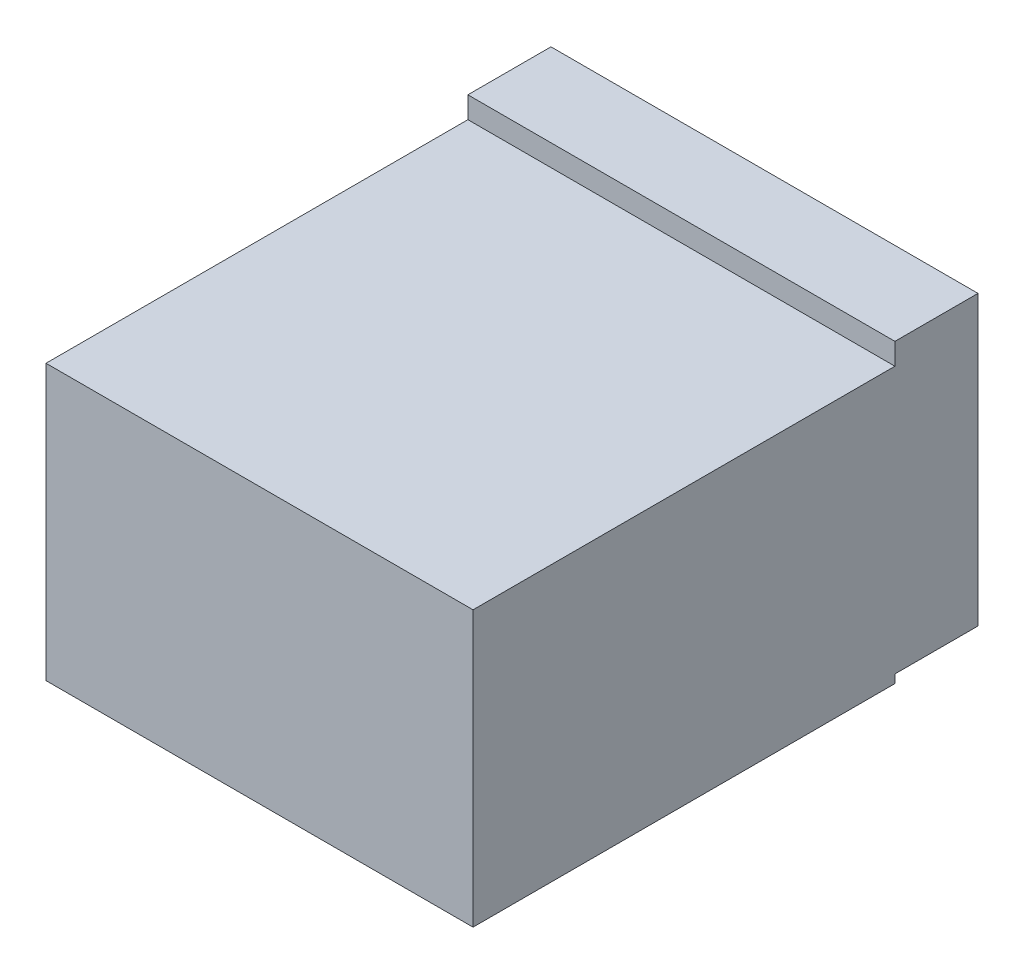
ISO-10303-21;
HEADER;
FILE_DESCRIPTION(('STEP AP214'),'2;1');
FILE_NAME('part.step','',(''),(''),'','','');
FILE_SCHEMA(('AUTOMOTIVE_DESIGN { 1 0 10303 214 1 1 1 1 }'));
ENDSEC;
DATA;
#1=APPLICATION_CONTEXT('core data for automotive mechanical design processes');
#2=APPLICATION_PROTOCOL_DEFINITION('international standard','automotive_design',2000,#1);
#3=PRODUCT_CONTEXT('',#1,'mechanical');
#4=PRODUCT('Part','Part','',(#3));
#5=PRODUCT_RELATED_PRODUCT_CATEGORY('part','',(#4));
#6=PRODUCT_DEFINITION_FORMATION('','',#4);
#7=PRODUCT_DEFINITION_CONTEXT('part definition',#1,'design');
#8=PRODUCT_DEFINITION('design','',#6,#7);
#9=PRODUCT_DEFINITION_SHAPE('','',#8);
#10=(LENGTH_UNIT() NAMED_UNIT(*) SI_UNIT(.MILLI.,.METRE.));
#11=(NAMED_UNIT(*) PLANE_ANGLE_UNIT() SI_UNIT($,.RADIAN.));
#12=(NAMED_UNIT(*) SI_UNIT($,.STERADIAN.) SOLID_ANGLE_UNIT());
#13=UNCERTAINTY_MEASURE_WITH_UNIT(LENGTH_MEASURE(1.E-05),#10,'distance_accuracy_value','');
#14=(GEOMETRIC_REPRESENTATION_CONTEXT(3) GLOBAL_UNCERTAINTY_ASSIGNED_CONTEXT((#13)) GLOBAL_UNIT_ASSIGNED_CONTEXT((#10,
#11,#12)) REPRESENTATION_CONTEXT('',''));
#15=CARTESIAN_POINT('',(0.,0.,0.));
#16=DIRECTION('',(0.,0.,1.));
#17=DIRECTION('',(1.,0.,0.));
#18=AXIS2_PLACEMENT_3D('',#15,#16,#17);
#19=CARTESIAN_POINT('',(0.,212.430186548326,-93.6724));
#20=DIRECTION('',(0.,0.,1.));
#21=DIRECTION('',(1.,0.,0.));
#22=AXIS2_PLACEMENT_3D('',#19,#20,#21);
#23=PLANE('',#22);
#24=DIRECTION('',(-1.,0.,0.));
#25=VECTOR('',#24,1.);
#26=CARTESIAN_POINT('',(0.,-10.8474000000001,-93.6724));
#27=LINE('',#26,#25);
#28=CARTESIAN_POINT('',(110.,-10.8474,-93.6724));
#29=VERTEX_POINT('',#28);
#30=CARTESIAN_POINT('',(0.,-10.8474000000001,-93.6724));
#31=VERTEX_POINT('',#30);
#32=EDGE_CURVE('E49',#29,#31,#27,.T.);
#33=ORIENTED_EDGE('',*,*,#32,.F.);
#34=DIRECTION('',(0.,-1.,0.));
#35=VECTOR('',#34,1.);
#36=CARTESIAN_POINT('',(110.,212.430186548326,-93.6724));
#37=LINE('',#36,#35);
#38=CARTESIAN_POINT('',(110.,-13.,-93.6724));
#39=VERTEX_POINT('',#38);
#40=EDGE_CURVE('E156',#29,#39,#37,.T.);
#41=ORIENTED_EDGE('',*,*,#40,.T.);
#42=DIRECTION('',(-1.,0.,0.));
#43=VECTOR('',#42,1.);
#44=CARTESIAN_POINT('',(0.,-13.,-93.6724));
#45=LINE('',#44,#43);
#46=CARTESIAN_POINT('',(0.,-13.,-93.6724));
#47=VERTEX_POINT('',#46);
#48=EDGE_CURVE('E142',#39,#47,#45,.T.);
#49=ORIENTED_EDGE('',*,*,#48,.T.);
#50=DIRECTION('',(0.,-1.,0.));
#51=VECTOR('',#50,1.);
#52=CARTESIAN_POINT('',(0.,212.430186548326,-93.6724));
#53=LINE('',#52,#51);
#54=EDGE_CURVE('E141',#31,#47,#53,.T.);
#55=ORIENTED_EDGE('',*,*,#54,.F.);
#56=EDGE_LOOP('',(#33,#41,#49,#55));
#57=FACE_BOUND('',#56,.T.);
#58=ADVANCED_FACE('F33',(#57),#23,.F.);
#59=CARTESIAN_POINT('',(110.,212.430186548326,-93.6724));
#60=DIRECTION('',(-1.,0.,0.));
#61=DIRECTION('',(0.,0.,1.));
#62=AXIS2_PLACEMENT_3D('',#59,#60,#61);
#63=PLANE('',#62);
#64=ORIENTED_EDGE('',*,*,#40,.F.);
#65=DIRECTION('',(0.,0.,1.));
#66=VECTOR('',#65,1.);
#67=CARTESIAN_POINT('',(110.,-10.8474000000001,-247.760246461358));
#68=LINE('',#67,#66);
#69=CARTESIAN_POINT('',(110.,-10.8474000000001,-115.074000000016));
#70=VERTEX_POINT('',#69);
#71=EDGE_CURVE('E164',#70,#29,#68,.T.);
#72=ORIENTED_EDGE('',*,*,#71,.F.);
#73=DIRECTION('',(0.,1.,0.));
#74=VECTOR('',#73,1.);
#75=CARTESIAN_POINT('',(110.,-10.8474000000001,-115.074000000016));
#76=LINE('',#75,#74);
#77=CARTESIAN_POINT('',(110.,63.3525999999998,-115.074000000016));
#78=VERTEX_POINT('',#77);
#79=EDGE_CURVE('E218',#70,#78,#76,.T.);
#80=ORIENTED_EDGE('',*,*,#79,.T.);
#81=DIRECTION('',(0.,0.,1.));
#82=VECTOR('',#81,1.);
#83=CARTESIAN_POINT('',(110.,63.3525999999998,-247.760246461358));
#84=LINE('',#83,#82);
#85=CARTESIAN_POINT('',(110.,63.3525999999998,-93.6724));
#86=VERTEX_POINT('',#85);
#87=EDGE_CURVE('E116',#78,#86,#84,.T.);
#88=ORIENTED_EDGE('',*,*,#87,.T.);
#89=DIRECTION('',(0.,-1.,0.));
#90=VECTOR('',#89,1.);
#91=CARTESIAN_POINT('',(110.,-10.8474000000001,-93.6724));
#92=LINE('',#91,#90);
#93=CARTESIAN_POINT('',(110.,57.8026,-93.6724));
#94=VERTEX_POINT('',#93);
#95=EDGE_CURVE('E120',#86,#94,#92,.T.);
#96=ORIENTED_EDGE('',*,*,#95,.T.);
#97=DIRECTION('',(0.,0.,1.));
#98=VECTOR('',#97,1.);
#99=CARTESIAN_POINT('',(110.,57.8026,-93.6724));
#100=LINE('',#99,#98);
#101=CARTESIAN_POINT('',(110.,57.8026,15.));
#102=VERTEX_POINT('',#101);
#103=EDGE_CURVE('E148',#94,#102,#100,.T.);
#104=ORIENTED_EDGE('',*,*,#103,.T.);
#105=DIRECTION('',(0.,-1.,0.));
#106=VECTOR('',#105,1.);
#107=CARTESIAN_POINT('',(110.,212.430186548326,15.));
#108=LINE('',#107,#106);
#109=CARTESIAN_POINT('',(110.,-13.,15.));
#110=VERTEX_POINT('',#109);
#111=EDGE_CURVE('E160',#102,#110,#108,.T.);
#112=ORIENTED_EDGE('',*,*,#111,.T.);
#113=DIRECTION('',(0.,0.,-1.));
#114=VECTOR('',#113,1.);
#115=CARTESIAN_POINT('',(110.,-13.,-93.6724));
#116=LINE('',#115,#114);
#117=EDGE_CURVE('E136',#110,#39,#116,.T.);
#118=ORIENTED_EDGE('',*,*,#117,.T.);
#119=EDGE_LOOP('',(#64,#72,#80,#88,#96,#104,#112,#118));
#120=FACE_BOUND('',#119,.T.);
#121=ADVANCED_FACE('F182',(#120),#63,.F.);
#122=CARTESIAN_POINT('',(0.,212.430186548326,15.));
#123=DIRECTION('',(0.,0.,-1.));
#124=DIRECTION('',(-1.,0.,0.));
#125=AXIS2_PLACEMENT_3D('',#122,#123,#124);
#126=PLANE('',#125);
#127=ORIENTED_EDGE('',*,*,#111,.F.);
#128=DIRECTION('',(-1.,0.,0.));
#129=VECTOR('',#128,1.);
#130=CARTESIAN_POINT('',(0.,57.8026,15.));
#131=LINE('',#130,#129);
#132=CARTESIAN_POINT('',(0.,57.8026,15.));
#133=VERTEX_POINT('',#132);
#134=EDGE_CURVE('E42',#102,#133,#131,.T.);
#135=ORIENTED_EDGE('',*,*,#134,.T.);
#136=DIRECTION('',(0.,-1.,0.));
#137=VECTOR('',#136,1.);
#138=CARTESIAN_POINT('',(0.,212.430186548326,15.));
#139=LINE('',#138,#137);
#140=CARTESIAN_POINT('',(0.,-13.,15.));
#141=VERTEX_POINT('',#140);
#142=EDGE_CURVE('E177',#133,#141,#139,.T.);
#143=ORIENTED_EDGE('',*,*,#142,.T.);
#144=DIRECTION('',(1.,0.,0.));
#145=VECTOR('',#144,1.);
#146=CARTESIAN_POINT('',(0.,-13.,15.));
#147=LINE('',#146,#145);
#148=EDGE_CURVE('E133',#141,#110,#147,.T.);
#149=ORIENTED_EDGE('',*,*,#148,.T.);
#150=EDGE_LOOP('',(#127,#135,#143,#149));
#151=FACE_BOUND('',#150,.T.);
#152=ADVANCED_FACE('F187',(#151),#126,.F.);
#153=CARTESIAN_POINT('',(0.,212.430186548326,-93.6724));
#154=DIRECTION('',(1.,0.,0.));
#155=DIRECTION('',(0.,0.,-1.));
#156=AXIS2_PLACEMENT_3D('',#153,#154,#155);
#157=PLANE('',#156);
#158=ORIENTED_EDGE('',*,*,#142,.F.);
#159=DIRECTION('',(0.,0.,-1.));
#160=VECTOR('',#159,1.);
#161=CARTESIAN_POINT('',(0.,57.8026,-93.6724));
#162=LINE('',#161,#160);
#163=CARTESIAN_POINT('',(0.,57.8026,-93.6724));
#164=VERTEX_POINT('',#163);
#165=EDGE_CURVE('E11',#133,#164,#162,.T.);
#166=ORIENTED_EDGE('',*,*,#165,.T.);
#167=DIRECTION('',(0.,1.,0.));
#168=VECTOR('',#167,1.);
#169=CARTESIAN_POINT('',(0.,-10.8474000000001,-93.6724));
#170=LINE('',#169,#168);
#171=CARTESIAN_POINT('',(0.,63.3525999999998,-93.6724));
#172=VERTEX_POINT('',#171);
#173=EDGE_CURVE('E98',#164,#172,#170,.T.);
#174=ORIENTED_EDGE('',*,*,#173,.T.);
#175=DIRECTION('',(0.,0.,1.));
#176=VECTOR('',#175,1.);
#177=CARTESIAN_POINT('',(0.,63.3525999999998,-247.760246461358));
#178=LINE('',#177,#176);
#179=CARTESIAN_POINT('',(0.,63.3525999999998,-115.074000000016));
#180=VERTEX_POINT('',#179);
#181=EDGE_CURVE('E102',#180,#172,#178,.T.);
#182=ORIENTED_EDGE('',*,*,#181,.F.);
#183=DIRECTION('',(0.,-1.,0.));
#184=VECTOR('',#183,1.);
#185=CARTESIAN_POINT('',(0.,-10.8474000000001,-115.074000000016));
#186=LINE('',#185,#184);
#187=CARTESIAN_POINT('',(0.,-10.8474000000001,-115.074000000016));
#188=VERTEX_POINT('',#187);
#189=EDGE_CURVE('E137',#180,#188,#186,.T.);
#190=ORIENTED_EDGE('',*,*,#189,.T.);
#191=DIRECTION('',(0.,0.,1.));
#192=VECTOR('',#191,1.);
#193=CARTESIAN_POINT('',(0.,-10.8474000000001,-247.760246461358));
#194=LINE('',#193,#192);
#195=EDGE_CURVE('E161',#188,#31,#194,.T.);
#196=ORIENTED_EDGE('',*,*,#195,.T.);
#197=ORIENTED_EDGE('',*,*,#54,.T.);
#198=DIRECTION('',(0.,0.,1.));
#199=VECTOR('',#198,1.);
#200=CARTESIAN_POINT('',(0.,-13.,-93.6724));
#201=LINE('',#200,#199);
#202=EDGE_CURVE('E138',#47,#141,#201,.T.);
#203=ORIENTED_EDGE('',*,*,#202,.T.);
#204=EDGE_LOOP('',(#158,#166,#174,#182,#190,#196,#197,#203));
#205=FACE_BOUND('',#204,.T.);
#206=ADVANCED_FACE('F35',(#205),#157,.F.);
#207=CARTESIAN_POINT('',(6.99080557524445,57.8026,-6.99999999999996));
#208=DIRECTION('',(0.,-1.,0.));
#209=DIRECTION('',(0.,0.,-1.));
#210=AXIS2_PLACEMENT_3D('',#207,#208,#209);
#211=PLANE('',#210);
#212=ORIENTED_EDGE('',*,*,#134,.F.);
#213=ORIENTED_EDGE('',*,*,#103,.F.);
#214=DIRECTION('',(1.,0.,0.));
#215=VECTOR('',#214,1.);
#216=CARTESIAN_POINT('',(0.,57.8026,-93.6724));
#217=LINE('',#216,#215);
#218=EDGE_CURVE('E174',#164,#94,#217,.T.);
#219=ORIENTED_EDGE('',*,*,#218,.F.);
#220=ORIENTED_EDGE('',*,*,#165,.F.);
#221=EDGE_LOOP('',(#212,#213,#219,#220));
#222=FACE_BOUND('',#221,.T.);
#223=ADVANCED_FACE('F193',(#222),#211,.F.);
#224=CARTESIAN_POINT('',(0.,-13.,0.));
#225=DIRECTION('',(0.,-1.,0.));
#226=DIRECTION('',(0.,0.,-1.));
#227=AXIS2_PLACEMENT_3D('',#224,#225,#226);
#228=PLANE('',#227);
#229=ORIENTED_EDGE('',*,*,#202,.F.);
#230=ORIENTED_EDGE('',*,*,#48,.F.);
#231=ORIENTED_EDGE('',*,*,#117,.F.);
#232=ORIENTED_EDGE('',*,*,#148,.F.);
#233=EDGE_LOOP('',(#229,#230,#231,#232));
#234=FACE_BOUND('',#233,.T.);
#235=ADVANCED_FACE('F186',(#234),#228,.T.);
#236=CARTESIAN_POINT('',(0.,0.,-93.6724));
#237=DIRECTION('',(0.,0.,-1.));
#238=DIRECTION('',(-1.,0.,0.));
#239=AXIS2_PLACEMENT_3D('',#236,#237,#238);
#240=PLANE('',#239);
#241=ORIENTED_EDGE('',*,*,#173,.F.);
#242=ORIENTED_EDGE('',*,*,#218,.T.);
#243=ORIENTED_EDGE('',*,*,#95,.F.);
#244=DIRECTION('',(1.,0.,0.));
#245=VECTOR('',#244,1.);
#246=CARTESIAN_POINT('',(0.,63.3525999999998,-93.6724));
#247=LINE('',#246,#245);
#248=EDGE_CURVE('E107',#172,#86,#247,.T.);
#249=ORIENTED_EDGE('',*,*,#248,.F.);
#250=EDGE_LOOP('',(#241,#242,#243,#249));
#251=FACE_BOUND('',#250,.T.);
#252=ADVANCED_FACE('F118',(#251),#240,.F.);
#253=CARTESIAN_POINT('',(0.,-10.8474000000001,-247.760246461358));
#254=DIRECTION('',(0.,1.,0.));
#255=DIRECTION('',(-1.,0.,0.));
#256=AXIS2_PLACEMENT_3D('',#253,#254,#255);
#257=PLANE('',#256);
#258=ORIENTED_EDGE('',*,*,#195,.F.);
#259=DIRECTION('',(1.,0.,0.));
#260=VECTOR('',#259,1.);
#261=CARTESIAN_POINT('',(0.,-10.8474000000001,-115.074000000016));
#262=LINE('',#261,#260);
#263=EDGE_CURVE('E115',#188,#70,#262,.T.);
#264=ORIENTED_EDGE('',*,*,#263,.T.);
#265=ORIENTED_EDGE('',*,*,#71,.T.);
#266=ORIENTED_EDGE('',*,*,#32,.T.);
#267=EDGE_LOOP('',(#258,#264,#265,#266));
#268=FACE_BOUND('',#267,.T.);
#269=ADVANCED_FACE('F207',(#268),#257,.F.);
#270=CARTESIAN_POINT('',(0.,63.3525999999998,-247.760246461358));
#271=DIRECTION('',(0.,-1.,0.));
#272=DIRECTION('',(1.,0.,0.));
#273=AXIS2_PLACEMENT_3D('',#270,#271,#272);
#274=PLANE('',#273);
#275=ORIENTED_EDGE('',*,*,#87,.F.);
#276=DIRECTION('',(-1.,0.,0.));
#277=VECTOR('',#276,1.);
#278=CARTESIAN_POINT('',(0.,63.3525999999998,-115.074000000016));
#279=LINE('',#278,#277);
#280=EDGE_CURVE('E114',#78,#180,#279,.T.);
#281=ORIENTED_EDGE('',*,*,#280,.T.);
#282=ORIENTED_EDGE('',*,*,#181,.T.);
#283=ORIENTED_EDGE('',*,*,#248,.T.);
#284=EDGE_LOOP('',(#275,#281,#282,#283));
#285=FACE_BOUND('',#284,.T.);
#286=ADVANCED_FACE('F112',(#285),#274,.F.);
#287=CARTESIAN_POINT('',(54.7500000000001,58.3525999999998,-115.074000000016));
#288=DIRECTION('',(0.,0.,1.));
#289=DIRECTION('',(1.,0.,0.));
#290=AXIS2_PLACEMENT_3D('',#287,#288,#289);
#291=PLANE('',#290);
#292=ORIENTED_EDGE('',*,*,#280,.F.);
#293=ORIENTED_EDGE('',*,*,#79,.F.);
#294=ORIENTED_EDGE('',*,*,#263,.F.);
#295=ORIENTED_EDGE('',*,*,#189,.F.);
#296=EDGE_LOOP('',(#292,#293,#294,#295));
#297=FACE_BOUND('',#296,.T.);
#298=ADVANCED_FACE('F206',(#297),#291,.F.);
#299=CLOSED_SHELL('',(#58,#121,#152,#206,#223,#235,#252,#269,#286,#298));
#300=MANIFOLD_SOLID_BREP('B2',#299);
#301=ADVANCED_BREP_SHAPE_REPRESENTATION('',(#18,#300),#14);
#302=SHAPE_DEFINITION_REPRESENTATION(#9,#301);
ENDSEC;
END-ISO-10303-21;
